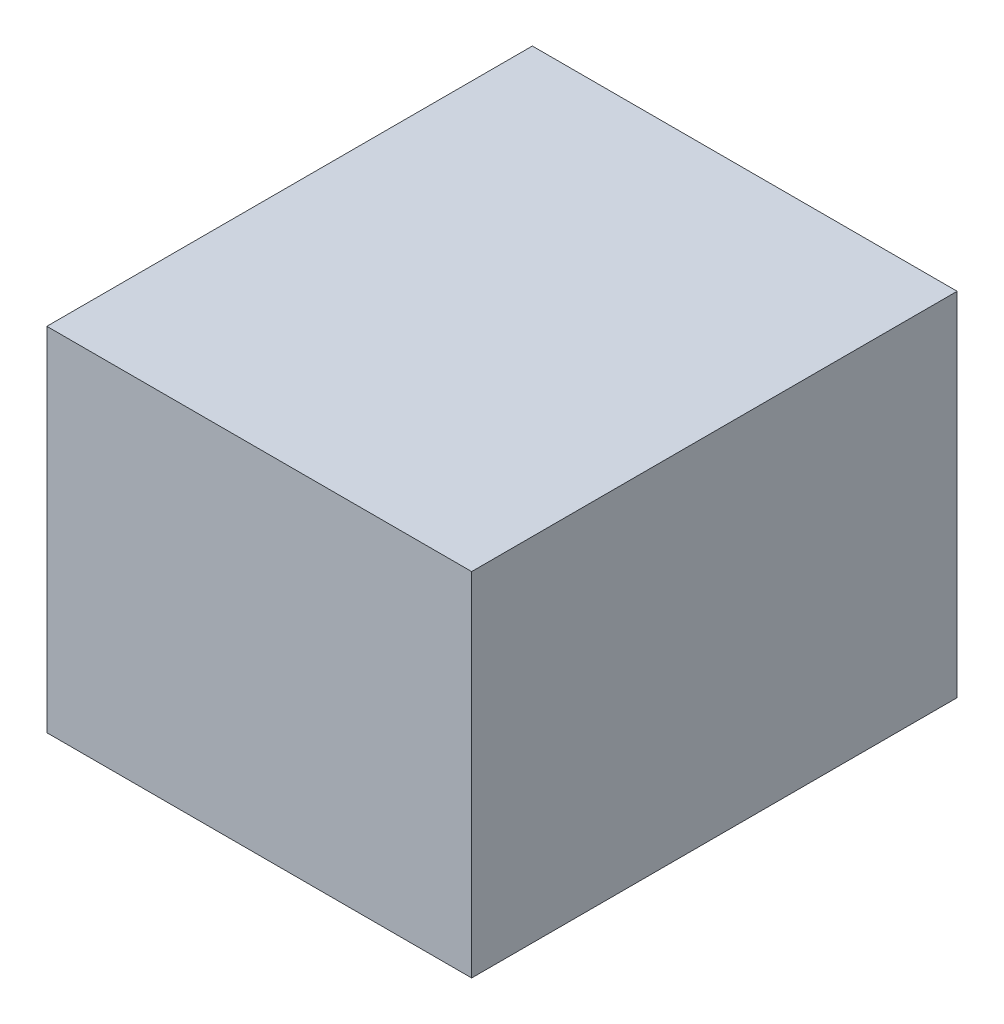
ISO-10303-21;
HEADER;
FILE_DESCRIPTION(('STEP AP214'),'2;1');
FILE_NAME('part.step','',(''),(''),'','','');
FILE_SCHEMA(('AUTOMOTIVE_DESIGN { 1 0 10303 214 1 1 1 1 }'));
ENDSEC;
DATA;
#1=APPLICATION_CONTEXT('core data for automotive mechanical design processes');
#2=APPLICATION_PROTOCOL_DEFINITION('international standard','automotive_design',2000,#1);
#3=PRODUCT_CONTEXT('',#1,'mechanical');
#4=PRODUCT('Part','Part','',(#3));
#5=PRODUCT_RELATED_PRODUCT_CATEGORY('part','',(#4));
#6=PRODUCT_DEFINITION_FORMATION('','',#4);
#7=PRODUCT_DEFINITION_CONTEXT('part definition',#1,'design');
#8=PRODUCT_DEFINITION('design','',#6,#7);
#9=PRODUCT_DEFINITION_SHAPE('','',#8);
#10=(LENGTH_UNIT() NAMED_UNIT(*) SI_UNIT(.MILLI.,.METRE.));
#11=(NAMED_UNIT(*) PLANE_ANGLE_UNIT() SI_UNIT($,.RADIAN.));
#12=(NAMED_UNIT(*) SI_UNIT($,.STERADIAN.) SOLID_ANGLE_UNIT());
#13=UNCERTAINTY_MEASURE_WITH_UNIT(LENGTH_MEASURE(1.E-05),#10,'distance_accuracy_value','');
#14=(GEOMETRIC_REPRESENTATION_CONTEXT(3) GLOBAL_UNCERTAINTY_ASSIGNED_CONTEXT((#13)) GLOBAL_UNIT_ASSIGNED_CONTEXT((#10,
#11,#12)) REPRESENTATION_CONTEXT('',''));
#15=CARTESIAN_POINT('',(0.,0.,0.));
#16=DIRECTION('',(0.,0.,1.));
#17=DIRECTION('',(1.,0.,0.));
#18=AXIS2_PLACEMENT_3D('',#15,#16,#17);
#19=CARTESIAN_POINT('',(-17.5,29.,-20.));
#20=DIRECTION('',(1.,0.,0.));
#21=DIRECTION('',(0.,0.,-1.));
#22=AXIS2_PLACEMENT_3D('',#19,#20,#21);
#23=PLANE('',#22);
#24=DIRECTION('',(0.,0.,1.));
#25=VECTOR('',#24,1.);
#26=CARTESIAN_POINT('',(-17.5,0.,-20.));
#27=LINE('',#26,#25);
#28=CARTESIAN_POINT('',(-17.5,0.,-20.));
#29=VERTEX_POINT('',#28);
#30=CARTESIAN_POINT('',(-17.5,0.,20.));
#31=VERTEX_POINT('',#30);
#32=EDGE_CURVE('E106',#29,#31,#27,.T.);
#33=ORIENTED_EDGE('',*,*,#32,.T.);
#34=DIRECTION('',(0.,-1.,0.));
#35=VECTOR('',#34,1.);
#36=CARTESIAN_POINT('',(-17.5,29.,20.));
#37=LINE('',#36,#35);
#38=CARTESIAN_POINT('',(-17.5,29.,20.));
#39=VERTEX_POINT('',#38);
#40=EDGE_CURVE('E11',#39,#31,#37,.T.);
#41=ORIENTED_EDGE('',*,*,#40,.F.);
#42=DIRECTION('',(0.,0.,1.));
#43=VECTOR('',#42,1.);
#44=CARTESIAN_POINT('',(-17.5,29.,-20.));
#45=LINE('',#44,#43);
#46=CARTESIAN_POINT('',(-17.5,29.,-20.));
#47=VERTEX_POINT('',#46);
#48=EDGE_CURVE('E94',#47,#39,#45,.T.);
#49=ORIENTED_EDGE('',*,*,#48,.F.);
#50=DIRECTION('',(0.,-1.,0.));
#51=VECTOR('',#50,1.);
#52=CARTESIAN_POINT('',(-17.5,29.,-20.));
#53=LINE('',#52,#51);
#54=EDGE_CURVE('E102',#47,#29,#53,.T.);
#55=ORIENTED_EDGE('',*,*,#54,.T.);
#56=EDGE_LOOP('',(#33,#41,#49,#55));
#57=FACE_BOUND('',#56,.T.);
#58=ADVANCED_FACE('F43',(#57),#23,.F.);
#59=CARTESIAN_POINT('',(17.5,29.,20.));
#60=DIRECTION('',(0.,0.,-1.));
#61=DIRECTION('',(-1.,0.,0.));
#62=AXIS2_PLACEMENT_3D('',#59,#60,#61);
#63=PLANE('',#62);
#64=DIRECTION('',(1.,0.,0.));
#65=VECTOR('',#64,1.);
#66=CARTESIAN_POINT('',(17.5,0.,20.));
#67=LINE('',#66,#65);
#68=CARTESIAN_POINT('',(17.5,0.,20.));
#69=VERTEX_POINT('',#68);
#70=EDGE_CURVE('E98',#31,#69,#67,.T.);
#71=ORIENTED_EDGE('',*,*,#70,.T.);
#72=DIRECTION('',(0.,-1.,0.));
#73=VECTOR('',#72,1.);
#74=CARTESIAN_POINT('',(17.5,29.,20.));
#75=LINE('',#74,#73);
#76=CARTESIAN_POINT('',(17.5,29.,20.));
#77=VERTEX_POINT('',#76);
#78=EDGE_CURVE('E51',#77,#69,#75,.T.);
#79=ORIENTED_EDGE('',*,*,#78,.F.);
#80=DIRECTION('',(1.,0.,0.));
#81=VECTOR('',#80,1.);
#82=CARTESIAN_POINT('',(17.5,29.,20.));
#83=LINE('',#82,#81);
#84=EDGE_CURVE('E89',#39,#77,#83,.T.);
#85=ORIENTED_EDGE('',*,*,#84,.F.);
#86=ORIENTED_EDGE('',*,*,#40,.T.);
#87=EDGE_LOOP('',(#71,#79,#85,#86));
#88=FACE_BOUND('',#87,.T.);
#89=ADVANCED_FACE('F97',(#88),#63,.F.);
#90=CARTESIAN_POINT('',(17.5,29.,-20.));
#91=DIRECTION('',(-1.,0.,0.));
#92=DIRECTION('',(0.,0.,1.));
#93=AXIS2_PLACEMENT_3D('',#90,#91,#92);
#94=PLANE('',#93);
#95=DIRECTION('',(0.,0.,-1.));
#96=VECTOR('',#95,1.);
#97=CARTESIAN_POINT('',(17.5,0.,-20.));
#98=LINE('',#97,#96);
#99=CARTESIAN_POINT('',(17.5,0.,-20.));
#100=VERTEX_POINT('',#99);
#101=EDGE_CURVE('E76',#69,#100,#98,.T.);
#102=ORIENTED_EDGE('',*,*,#101,.T.);
#103=DIRECTION('',(0.,-1.,0.));
#104=VECTOR('',#103,1.);
#105=CARTESIAN_POINT('',(17.5,29.,-20.));
#106=LINE('',#105,#104);
#107=CARTESIAN_POINT('',(17.5,29.,-20.));
#108=VERTEX_POINT('',#107);
#109=EDGE_CURVE('E99',#108,#100,#106,.T.);
#110=ORIENTED_EDGE('',*,*,#109,.F.);
#111=DIRECTION('',(0.,0.,-1.));
#112=VECTOR('',#111,1.);
#113=CARTESIAN_POINT('',(17.5,29.,-20.));
#114=LINE('',#113,#112);
#115=EDGE_CURVE('E92',#77,#108,#114,.T.);
#116=ORIENTED_EDGE('',*,*,#115,.F.);
#117=ORIENTED_EDGE('',*,*,#78,.T.);
#118=EDGE_LOOP('',(#102,#110,#116,#117));
#119=FACE_BOUND('',#118,.T.);
#120=ADVANCED_FACE('F100',(#119),#94,.F.);
#121=CARTESIAN_POINT('',(17.5,29.,-20.));
#122=DIRECTION('',(0.,0.,1.));
#123=DIRECTION('',(1.,0.,0.));
#124=AXIS2_PLACEMENT_3D('',#121,#122,#123);
#125=PLANE('',#124);
#126=DIRECTION('',(-1.,0.,0.));
#127=VECTOR('',#126,1.);
#128=CARTESIAN_POINT('',(17.5,0.,-20.));
#129=LINE('',#128,#127);
#130=EDGE_CURVE('E82',#100,#29,#129,.T.);
#131=ORIENTED_EDGE('',*,*,#130,.T.);
#132=ORIENTED_EDGE('',*,*,#54,.F.);
#133=DIRECTION('',(-1.,0.,0.));
#134=VECTOR('',#133,1.);
#135=CARTESIAN_POINT('',(17.5,29.,-20.));
#136=LINE('',#135,#134);
#137=EDGE_CURVE('E59',#108,#47,#136,.T.);
#138=ORIENTED_EDGE('',*,*,#137,.F.);
#139=ORIENTED_EDGE('',*,*,#109,.T.);
#140=EDGE_LOOP('',(#131,#132,#138,#139));
#141=FACE_BOUND('',#140,.T.);
#142=ADVANCED_FACE('F113',(#141),#125,.F.);
#143=CARTESIAN_POINT('',(0.,29.,0.));
#144=DIRECTION('',(0.,-1.,0.));
#145=DIRECTION('',(0.,0.,-1.));
#146=AXIS2_PLACEMENT_3D('',#143,#144,#145);
#147=PLANE('',#146);
#148=ORIENTED_EDGE('',*,*,#48,.T.);
#149=ORIENTED_EDGE('',*,*,#84,.T.);
#150=ORIENTED_EDGE('',*,*,#115,.T.);
#151=ORIENTED_EDGE('',*,*,#137,.T.);
#152=EDGE_LOOP('',(#148,#149,#150,#151));
#153=FACE_BOUND('',#152,.T.);
#154=ADVANCED_FACE('F90',(#153),#147,.F.);
#155=CARTESIAN_POINT('',(0.,0.,0.));
#156=DIRECTION('',(0.,-1.,0.));
#157=DIRECTION('',(0.,0.,-1.));
#158=AXIS2_PLACEMENT_3D('',#155,#156,#157);
#159=PLANE('',#158);
#160=ORIENTED_EDGE('',*,*,#32,.F.);
#161=ORIENTED_EDGE('',*,*,#130,.F.);
#162=ORIENTED_EDGE('',*,*,#101,.F.);
#163=ORIENTED_EDGE('',*,*,#70,.F.);
#164=EDGE_LOOP('',(#160,#161,#162,#163));
#165=FACE_BOUND('',#164,.T.);
#166=ADVANCED_FACE('F116',(#165),#159,.T.);
#167=CLOSED_SHELL('',(#58,#89,#120,#142,#154,#166));
#168=MANIFOLD_SOLID_BREP('B2',#167);
#169=ADVANCED_BREP_SHAPE_REPRESENTATION('',(#18,#168),#14);
#170=SHAPE_DEFINITION_REPRESENTATION(#9,#169);
ENDSEC;
END-ISO-10303-21;
